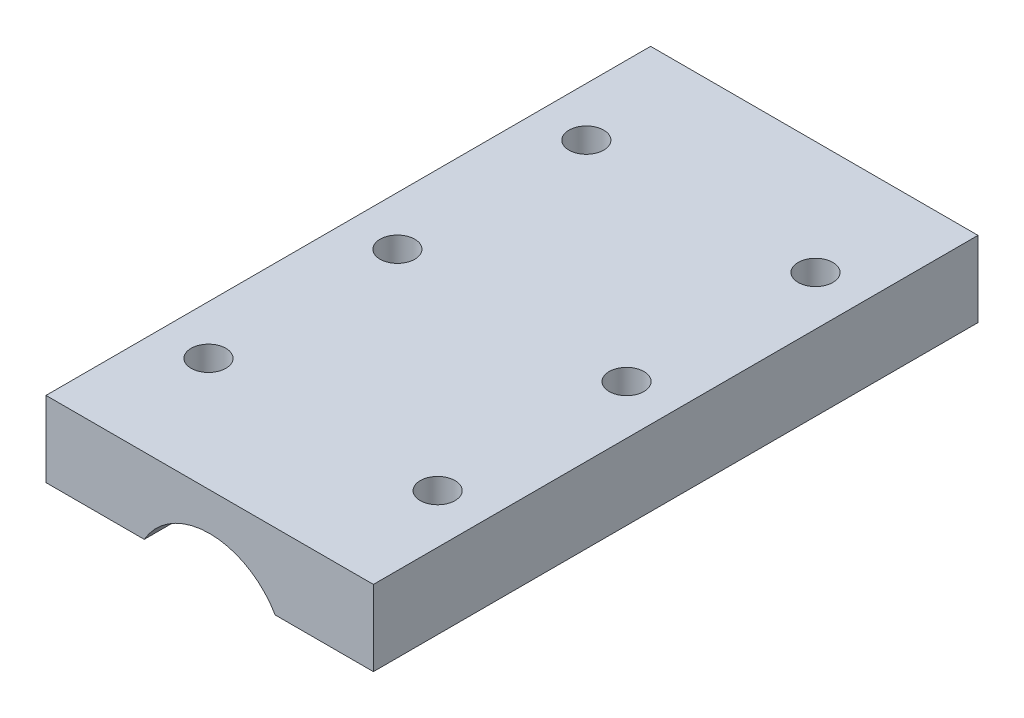
ISO-10303-21;
HEADER;
FILE_DESCRIPTION(('STEP AP214'),'2;1');
FILE_NAME('part.step','',(''),(''),'','','');
FILE_SCHEMA(('AUTOMOTIVE_DESIGN { 1 0 10303 214 1 1 1 1 }'));
ENDSEC;
DATA;
#1=APPLICATION_CONTEXT('core data for automotive mechanical design processes');
#2=APPLICATION_PROTOCOL_DEFINITION('international standard','automotive_design',2000,#1);
#3=PRODUCT_CONTEXT('',#1,'mechanical');
#4=PRODUCT('Part','Part','',(#3));
#5=PRODUCT_RELATED_PRODUCT_CATEGORY('part','',(#4));
#6=PRODUCT_DEFINITION_FORMATION('','',#4);
#7=PRODUCT_DEFINITION_CONTEXT('part definition',#1,'design');
#8=PRODUCT_DEFINITION('design','',#6,#7);
#9=PRODUCT_DEFINITION_SHAPE('','',#8);
#10=(LENGTH_UNIT() NAMED_UNIT(*) SI_UNIT(.MILLI.,.METRE.));
#11=(NAMED_UNIT(*) PLANE_ANGLE_UNIT() SI_UNIT($,.RADIAN.));
#12=(NAMED_UNIT(*) SI_UNIT($,.STERADIAN.) SOLID_ANGLE_UNIT());
#13=UNCERTAINTY_MEASURE_WITH_UNIT(LENGTH_MEASURE(1.E-05),#10,'distance_accuracy_value','');
#14=(GEOMETRIC_REPRESENTATION_CONTEXT(3) GLOBAL_UNCERTAINTY_ASSIGNED_CONTEXT((#13)) GLOBAL_UNIT_ASSIGNED_CONTEXT((#10,
#11,#12)) REPRESENTATION_CONTEXT('',''));
#15=CARTESIAN_POINT('',(0.,0.,0.));
#16=DIRECTION('',(0.,0.,1.));
#17=DIRECTION('',(1.,0.,0.));
#18=AXIS2_PLACEMENT_3D('',#15,#16,#17);
#19=CARTESIAN_POINT('',(0.,0.,0.));
#20=DIRECTION('',(0.,-1.,0.));
#21=DIRECTION('',(0.,0.,-1.));
#22=AXIS2_PLACEMENT_3D('',#19,#20,#21);
#23=PLANE('',#22);
#24=CARTESIAN_POINT('',(7.58012701999999,0.,0.));
#25=DIRECTION('',(0.,-1.,0.));
#26=DIRECTION('',(0.,0.,-1.));
#27=AXIS2_PLACEMENT_3D('',#24,#25,#26);
#28=CIRCLE('',#27,1.15);
#29=CARTESIAN_POINT('',(7.58012701999999,0.,-1.15));
#30=VERTEX_POINT('',#29);
#31=EDGE_CURVE('E160',#30,#30,#28,.T.);
#32=ORIENTED_EDGE('',*,*,#31,.F.);
#33=EDGE_LOOP('',(#32));
#34=FACE_BOUND('',#33,.T.);
#35=CARTESIAN_POINT('',(7.58012701999999,0.,-12.5));
#36=DIRECTION('',(0.,-1.,0.));
#37=DIRECTION('',(0.,0.,1.));
#38=AXIS2_PLACEMENT_3D('',#35,#36,#37);
#39=CIRCLE('',#38,1.15);
#40=CARTESIAN_POINT('',(7.58012701999999,0.,-11.35));
#41=VERTEX_POINT('',#40);
#42=EDGE_CURVE('E166',#41,#41,#39,.T.);
#43=ORIENTED_EDGE('',*,*,#42,.F.);
#44=EDGE_LOOP('',(#43));
#45=FACE_BOUND('',#44,.T.);
#46=CARTESIAN_POINT('',(7.58012701999999,0.,12.5));
#47=DIRECTION('',(0.,-1.,0.));
#48=DIRECTION('',(0.,0.,-1.));
#49=AXIS2_PLACEMENT_3D('',#46,#47,#48);
#50=CIRCLE('',#49,1.15);
#51=CARTESIAN_POINT('',(7.58012701999999,0.,11.35));
#52=VERTEX_POINT('',#51);
#53=EDGE_CURVE('E140',#52,#52,#50,.T.);
#54=ORIENTED_EDGE('',*,*,#53,.F.);
#55=EDGE_LOOP('',(#54));
#56=FACE_BOUND('',#55,.T.);
#57=DIRECTION('',(0.,0.,1.));
#58=VECTOR('',#57,1.);
#59=CARTESIAN_POINT('',(4.33012702,0.,-29.0138781912488));
#60=LINE('',#59,#58);
#61=CARTESIAN_POINT('',(4.33012702,0.,-20.));
#62=VERTEX_POINT('',#61);
#63=CARTESIAN_POINT('',(4.33012702,0.,20.));
#64=VERTEX_POINT('',#63);
#65=EDGE_CURVE('E95',#62,#64,#60,.T.);
#66=ORIENTED_EDGE('',*,*,#65,.F.);
#67=DIRECTION('',(-1.,0.,0.));
#68=VECTOR('',#67,1.);
#69=CARTESIAN_POINT('',(10.83012702,0.,-20.));
#70=LINE('',#69,#68);
#71=CARTESIAN_POINT('',(10.83012702,0.,-20.));
#72=VERTEX_POINT('',#71);
#73=EDGE_CURVE('E120',#72,#62,#70,.T.);
#74=ORIENTED_EDGE('',*,*,#73,.F.);
#75=DIRECTION('',(0.,0.,-1.));
#76=VECTOR('',#75,1.);
#77=CARTESIAN_POINT('',(10.83012702,0.,-20.));
#78=LINE('',#77,#76);
#79=CARTESIAN_POINT('',(10.83012702,0.,20.));
#80=VERTEX_POINT('',#79);
#81=EDGE_CURVE('E112',#80,#72,#78,.T.);
#82=ORIENTED_EDGE('',*,*,#81,.F.);
#83=DIRECTION('',(1.,0.,0.));
#84=VECTOR('',#83,1.);
#85=CARTESIAN_POINT('',(10.83012702,0.,20.));
#86=LINE('',#85,#84);
#87=EDGE_CURVE('E106',#64,#80,#86,.T.);
#88=ORIENTED_EDGE('',*,*,#87,.F.);
#89=EDGE_LOOP('',(#66,#74,#82,#88));
#90=FACE_BOUND('',#89,.T.);
#91=ADVANCED_FACE('F35',(#34,#45,#56,#90),#23,.T.);
#92=CARTESIAN_POINT('',(-10.83012702,5.,-20.));
#93=DIRECTION('',(1.,0.,0.));
#94=DIRECTION('',(0.,0.,-1.));
#95=AXIS2_PLACEMENT_3D('',#92,#93,#94);
#96=PLANE('',#95);
#97=DIRECTION('',(0.,0.,1.));
#98=VECTOR('',#97,1.);
#99=CARTESIAN_POINT('',(-10.83012702,0.,-20.));
#100=LINE('',#99,#98);
#101=CARTESIAN_POINT('',(-10.83012702,0.,-20.));
#102=VERTEX_POINT('',#101);
#103=CARTESIAN_POINT('',(-10.83012702,0.,20.));
#104=VERTEX_POINT('',#103);
#105=EDGE_CURVE('E113',#102,#104,#100,.T.);
#106=ORIENTED_EDGE('',*,*,#105,.T.);
#107=DIRECTION('',(0.,-1.,0.));
#108=VECTOR('',#107,1.);
#109=CARTESIAN_POINT('',(-10.83012702,5.,20.));
#110=LINE('',#109,#108);
#111=CARTESIAN_POINT('',(-10.83012702,5.,20.));
#112=VERTEX_POINT('',#111);
#113=EDGE_CURVE('E11',#112,#104,#110,.T.);
#114=ORIENTED_EDGE('',*,*,#113,.F.);
#115=DIRECTION('',(0.,0.,1.));
#116=VECTOR('',#115,1.);
#117=CARTESIAN_POINT('',(-10.83012702,5.,-20.));
#118=LINE('',#117,#116);
#119=CARTESIAN_POINT('',(-10.83012702,5.,-20.));
#120=VERTEX_POINT('',#119);
#121=EDGE_CURVE('E122',#120,#112,#118,.T.);
#122=ORIENTED_EDGE('',*,*,#121,.F.);
#123=DIRECTION('',(0.,-1.,0.));
#124=VECTOR('',#123,1.);
#125=CARTESIAN_POINT('',(-10.83012702,5.,-20.));
#126=LINE('',#125,#124);
#127=EDGE_CURVE('E123',#120,#102,#126,.T.);
#128=ORIENTED_EDGE('',*,*,#127,.T.);
#129=EDGE_LOOP('',(#106,#114,#122,#128));
#130=FACE_BOUND('',#129,.T.);
#131=ADVANCED_FACE('F37',(#130),#96,.F.);
#132=CARTESIAN_POINT('',(10.83012702,5.,20.));
#133=DIRECTION('',(0.,0.,-1.));
#134=DIRECTION('',(-1.,0.,0.));
#135=AXIS2_PLACEMENT_3D('',#132,#133,#134);
#136=PLANE('',#135);
#137=CARTESIAN_POINT('',(-4.33012702,0.,20.));
#138=VERTEX_POINT('',#137);
#139=EDGE_CURVE('E108',#104,#138,#86,.T.);
#140=ORIENTED_EDGE('',*,*,#139,.T.);
#141=CARTESIAN_POINT('',(0.,-2.49999999813319,20.));
#142=DIRECTION('',(0.,0.,1.));
#143=DIRECTION('',(-1.,0.,0.));
#144=AXIS2_PLACEMENT_3D('',#141,#142,#143);
#145=CIRCLE('',#144,5.);
#146=EDGE_CURVE('E50',#64,#138,#145,.T.);
#147=ORIENTED_EDGE('',*,*,#146,.F.);
#148=ORIENTED_EDGE('',*,*,#87,.T.);
#149=DIRECTION('',(0.,-1.,0.));
#150=VECTOR('',#149,1.);
#151=CARTESIAN_POINT('',(10.83012702,5.,20.));
#152=LINE('',#151,#150);
#153=CARTESIAN_POINT('',(10.83012702,5.,20.));
#154=VERTEX_POINT('',#153);
#155=EDGE_CURVE('E43',#154,#80,#152,.T.);
#156=ORIENTED_EDGE('',*,*,#155,.F.);
#157=DIRECTION('',(1.,0.,0.));
#158=VECTOR('',#157,1.);
#159=CARTESIAN_POINT('',(10.83012702,5.,20.));
#160=LINE('',#159,#158);
#161=EDGE_CURVE('E87',#112,#154,#160,.T.);
#162=ORIENTED_EDGE('',*,*,#161,.F.);
#163=ORIENTED_EDGE('',*,*,#113,.T.);
#164=EDGE_LOOP('',(#140,#147,#148,#156,#162,#163));
#165=FACE_BOUND('',#164,.T.);
#166=ADVANCED_FACE('F105',(#165),#136,.F.);
#167=CARTESIAN_POINT('',(10.83012702,5.,-20.));
#168=DIRECTION('',(-1.,0.,0.));
#169=DIRECTION('',(0.,0.,1.));
#170=AXIS2_PLACEMENT_3D('',#167,#168,#169);
#171=PLANE('',#170);
#172=ORIENTED_EDGE('',*,*,#81,.T.);
#173=DIRECTION('',(0.,-1.,0.));
#174=VECTOR('',#173,1.);
#175=CARTESIAN_POINT('',(10.83012702,5.,-20.));
#176=LINE('',#175,#174);
#177=CARTESIAN_POINT('',(10.83012702,5.,-20.));
#178=VERTEX_POINT('',#177);
#179=EDGE_CURVE('E125',#178,#72,#176,.T.);
#180=ORIENTED_EDGE('',*,*,#179,.F.);
#181=DIRECTION('',(0.,0.,-1.));
#182=VECTOR('',#181,1.);
#183=CARTESIAN_POINT('',(10.83012702,5.,-20.));
#184=LINE('',#183,#182);
#185=EDGE_CURVE('E131',#154,#178,#184,.T.);
#186=ORIENTED_EDGE('',*,*,#185,.F.);
#187=ORIENTED_EDGE('',*,*,#155,.T.);
#188=EDGE_LOOP('',(#172,#180,#186,#187));
#189=FACE_BOUND('',#188,.T.);
#190=ADVANCED_FACE('F129',(#189),#171,.F.);
#191=CARTESIAN_POINT('',(10.83012702,5.,-20.));
#192=DIRECTION('',(0.,0.,1.));
#193=DIRECTION('',(1.,0.,0.));
#194=AXIS2_PLACEMENT_3D('',#191,#192,#193);
#195=PLANE('',#194);
#196=ORIENTED_EDGE('',*,*,#73,.T.);
#197=CARTESIAN_POINT('',(0.,-2.49999999813319,-20.));
#198=DIRECTION('',(0.,0.,1.));
#199=DIRECTION('',(1.,0.,0.));
#200=AXIS2_PLACEMENT_3D('',#197,#198,#199);
#201=CIRCLE('',#200,5.);
#202=CARTESIAN_POINT('',(-4.33012702,0.,-20.));
#203=VERTEX_POINT('',#202);
#204=EDGE_CURVE('E97',#203,#62,#201,.F.);
#205=ORIENTED_EDGE('',*,*,#204,.F.);
#206=EDGE_CURVE('E80',#203,#102,#70,.T.);
#207=ORIENTED_EDGE('',*,*,#206,.T.);
#208=ORIENTED_EDGE('',*,*,#127,.F.);
#209=DIRECTION('',(-1.,0.,0.));
#210=VECTOR('',#209,1.);
#211=CARTESIAN_POINT('',(10.83012702,5.,-20.));
#212=LINE('',#211,#210);
#213=EDGE_CURVE('E59',#178,#120,#212,.T.);
#214=ORIENTED_EDGE('',*,*,#213,.F.);
#215=ORIENTED_EDGE('',*,*,#179,.T.);
#216=EDGE_LOOP('',(#196,#205,#207,#208,#214,#215));
#217=FACE_BOUND('',#216,.T.);
#218=ADVANCED_FACE('F205',(#217),#195,.F.);
#219=CARTESIAN_POINT('',(0.,5.,0.));
#220=DIRECTION('',(0.,-1.,0.));
#221=DIRECTION('',(0.,0.,-1.));
#222=AXIS2_PLACEMENT_3D('',#219,#220,#221);
#223=PLANE('',#222);
#224=CARTESIAN_POINT('',(-7.58012701999999,5.,12.5));
#225=DIRECTION('',(0.,-1.,0.));
#226=DIRECTION('',(0.,0.,-1.));
#227=AXIS2_PLACEMENT_3D('',#224,#225,#226);
#228=CIRCLE('',#227,1.15);
#229=CARTESIAN_POINT('',(-7.58012701999999,5.,11.35));
#230=VERTEX_POINT('',#229);
#231=EDGE_CURVE('E144',#230,#230,#228,.F.);
#232=ORIENTED_EDGE('',*,*,#231,.F.);
#233=EDGE_LOOP('',(#232));
#234=FACE_BOUND('',#233,.T.);
#235=CARTESIAN_POINT('',(-7.58012701999999,5.,0.));
#236=DIRECTION('',(0.,-1.,0.));
#237=DIRECTION('',(0.,0.,-1.));
#238=AXIS2_PLACEMENT_3D('',#235,#236,#237);
#239=CIRCLE('',#238,1.15);
#240=CARTESIAN_POINT('',(-7.58012701999999,5.,-1.15));
#241=VERTEX_POINT('',#240);
#242=EDGE_CURVE('E151',#241,#241,#239,.F.);
#243=ORIENTED_EDGE('',*,*,#242,.F.);
#244=EDGE_LOOP('',(#243));
#245=FACE_BOUND('',#244,.T.);
#246=CARTESIAN_POINT('',(-7.58012701999999,5.,-12.5));
#247=DIRECTION('',(0.,-1.,0.));
#248=DIRECTION('',(0.,0.,-1.));
#249=AXIS2_PLACEMENT_3D('',#246,#247,#248);
#250=CIRCLE('',#249,1.15);
#251=CARTESIAN_POINT('',(-7.58012701999999,5.,-13.65));
#252=VERTEX_POINT('',#251);
#253=EDGE_CURVE('E157',#252,#252,#250,.F.);
#254=ORIENTED_EDGE('',*,*,#253,.F.);
#255=EDGE_LOOP('',(#254));
#256=FACE_BOUND('',#255,.T.);
#257=CARTESIAN_POINT('',(7.58012701999999,5.,0.));
#258=DIRECTION('',(0.,-1.,0.));
#259=DIRECTION('',(0.,0.,-1.));
#260=AXIS2_PLACEMENT_3D('',#257,#258,#259);
#261=CIRCLE('',#260,1.15);
#262=CARTESIAN_POINT('',(7.58012701999999,5.,-1.15));
#263=VERTEX_POINT('',#262);
#264=EDGE_CURVE('E163',#263,#263,#261,.F.);
#265=ORIENTED_EDGE('',*,*,#264,.F.);
#266=EDGE_LOOP('',(#265));
#267=FACE_BOUND('',#266,.T.);
#268=CARTESIAN_POINT('',(7.58012701999999,5.,-12.5));
#269=DIRECTION('',(0.,-1.,0.));
#270=DIRECTION('',(0.,0.,-1.));
#271=AXIS2_PLACEMENT_3D('',#268,#269,#270);
#272=CIRCLE('',#271,1.15);
#273=CARTESIAN_POINT('',(7.58012701999999,5.,-13.65));
#274=VERTEX_POINT('',#273);
#275=EDGE_CURVE('E143',#274,#274,#272,.F.);
#276=ORIENTED_EDGE('',*,*,#275,.F.);
#277=EDGE_LOOP('',(#276));
#278=FACE_BOUND('',#277,.T.);
#279=CARTESIAN_POINT('',(7.58012701999999,5.,12.5));
#280=DIRECTION('',(0.,-1.,0.));
#281=DIRECTION('',(0.,0.,-1.));
#282=AXIS2_PLACEMENT_3D('',#279,#280,#281);
#283=CIRCLE('',#282,1.15);
#284=CARTESIAN_POINT('',(7.58012701999999,5.,11.35));
#285=VERTEX_POINT('',#284);
#286=EDGE_CURVE('E109',#285,#285,#283,.F.);
#287=ORIENTED_EDGE('',*,*,#286,.F.);
#288=EDGE_LOOP('',(#287));
#289=FACE_BOUND('',#288,.T.);
#290=ORIENTED_EDGE('',*,*,#121,.T.);
#291=ORIENTED_EDGE('',*,*,#161,.T.);
#292=ORIENTED_EDGE('',*,*,#185,.T.);
#293=ORIENTED_EDGE('',*,*,#213,.T.);
#294=EDGE_LOOP('',(#290,#291,#292,#293));
#295=FACE_BOUND('',#294,.T.);
#296=ADVANCED_FACE('F203',(#234,#245,#256,#267,#278,#289,#295),#223,.F.);
#297=CARTESIAN_POINT('',(-7.58012701999999,0.,12.5));
#298=DIRECTION('',(0.,-1.,0.));
#299=DIRECTION('',(0.,0.,1.));
#300=AXIS2_PLACEMENT_3D('',#297,#298,#299);
#301=CIRCLE('',#300,1.15);
#302=CARTESIAN_POINT('',(-7.58012701999999,0.,13.65));
#303=VERTEX_POINT('',#302);
#304=EDGE_CURVE('E148',#303,#303,#301,.T.);
#305=ORIENTED_EDGE('',*,*,#304,.F.);
#306=EDGE_LOOP('',(#305));
#307=FACE_BOUND('',#306,.T.);
#308=CARTESIAN_POINT('',(-7.58012701999999,0.,0.));
#309=DIRECTION('',(0.,-1.,0.));
#310=DIRECTION('',(0.,0.,1.));
#311=AXIS2_PLACEMENT_3D('',#308,#309,#310);
#312=CIRCLE('',#311,1.15);
#313=CARTESIAN_POINT('',(-7.58012701999999,0.,1.15));
#314=VERTEX_POINT('',#313);
#315=EDGE_CURVE('E147',#314,#314,#312,.T.);
#316=ORIENTED_EDGE('',*,*,#315,.F.);
#317=EDGE_LOOP('',(#316));
#318=FACE_BOUND('',#317,.T.);
#319=CARTESIAN_POINT('',(-7.58012701999999,0.,-12.5));
#320=DIRECTION('',(0.,-1.,0.));
#321=DIRECTION('',(0.,0.,-1.));
#322=AXIS2_PLACEMENT_3D('',#319,#320,#321);
#323=CIRCLE('',#322,1.15);
#324=CARTESIAN_POINT('',(-7.58012701999999,0.,-13.65));
#325=VERTEX_POINT('',#324);
#326=EDGE_CURVE('E154',#325,#325,#323,.T.);
#327=ORIENTED_EDGE('',*,*,#326,.F.);
#328=EDGE_LOOP('',(#327));
#329=FACE_BOUND('',#328,.T.);
#330=DIRECTION('',(0.,0.,1.));
#331=VECTOR('',#330,1.);
#332=CARTESIAN_POINT('',(-4.33012702,0.,-29.0138781912488));
#333=LINE('',#332,#331);
#334=EDGE_CURVE('E102',#203,#138,#333,.T.);
#335=ORIENTED_EDGE('',*,*,#334,.T.);
#336=ORIENTED_EDGE('',*,*,#139,.F.);
#337=ORIENTED_EDGE('',*,*,#105,.F.);
#338=ORIENTED_EDGE('',*,*,#206,.F.);
#339=EDGE_LOOP('',(#335,#336,#337,#338));
#340=FACE_BOUND('',#339,.T.);
#341=ADVANCED_FACE('F180',(#307,#318,#329,#340),#23,.T.);
#342=CARTESIAN_POINT('',(0.,-2.49999999813319,-29.0138781912488));
#343=DIRECTION('',(0.,0.,1.));
#344=DIRECTION('',(1.,0.,0.));
#345=AXIS2_PLACEMENT_3D('',#342,#343,#344);
#346=CYLINDRICAL_SURFACE('',#345,5.);
#347=ORIENTED_EDGE('',*,*,#204,.T.);
#348=ORIENTED_EDGE('',*,*,#65,.T.);
#349=ORIENTED_EDGE('',*,*,#146,.T.);
#350=ORIENTED_EDGE('',*,*,#334,.F.);
#351=EDGE_LOOP('',(#347,#348,#349,#350));
#352=FACE_BOUND('',#351,.T.);
#353=ADVANCED_FACE('F96',(#352),#346,.F.);
#354=CARTESIAN_POINT('',(-7.58012701999999,8.25269119345812,-12.5));
#355=DIRECTION('',(0.,-1.,0.));
#356=DIRECTION('',(0.,0.,-1.));
#357=AXIS2_PLACEMENT_3D('',#354,#355,#356);
#358=CYLINDRICAL_SURFACE('',#357,1.15);
#359=ORIENTED_EDGE('',*,*,#253,.T.);
#360=EDGE_LOOP('',(#359));
#361=FACE_BOUND('',#360,.T.);
#362=ORIENTED_EDGE('',*,*,#326,.T.);
#363=EDGE_LOOP('',(#362));
#364=FACE_BOUND('',#363,.T.);
#365=ADVANCED_FACE('F202',(#361,#364),#358,.F.);
#366=CARTESIAN_POINT('',(-7.58012701999999,8.25269119345812,0.));
#367=DIRECTION('',(0.,-1.,0.));
#368=DIRECTION('',(0.,0.,-1.));
#369=AXIS2_PLACEMENT_3D('',#366,#367,#368);
#370=CYLINDRICAL_SURFACE('',#369,1.15);
#371=ORIENTED_EDGE('',*,*,#242,.T.);
#372=EDGE_LOOP('',(#371));
#373=FACE_BOUND('',#372,.T.);
#374=ORIENTED_EDGE('',*,*,#315,.T.);
#375=EDGE_LOOP('',(#374));
#376=FACE_BOUND('',#375,.T.);
#377=ADVANCED_FACE('F195',(#373,#376),#370,.F.);
#378=CARTESIAN_POINT('',(-7.58012701999999,8.25269119345812,12.5));
#379=DIRECTION('',(0.,-1.,0.));
#380=DIRECTION('',(0.,0.,-1.));
#381=AXIS2_PLACEMENT_3D('',#378,#379,#380);
#382=CYLINDRICAL_SURFACE('',#381,1.15);
#383=ORIENTED_EDGE('',*,*,#231,.T.);
#384=EDGE_LOOP('',(#383));
#385=FACE_BOUND('',#384,.T.);
#386=ORIENTED_EDGE('',*,*,#304,.T.);
#387=EDGE_LOOP('',(#386));
#388=FACE_BOUND('',#387,.T.);
#389=ADVANCED_FACE('F185',(#385,#388),#382,.F.);
#390=CARTESIAN_POINT('',(7.58012701999999,8.25269119345812,12.5));
#391=DIRECTION('',(0.,-1.,0.));
#392=DIRECTION('',(0.,0.,-1.));
#393=AXIS2_PLACEMENT_3D('',#390,#391,#392);
#394=CYLINDRICAL_SURFACE('',#393,1.15);
#395=ORIENTED_EDGE('',*,*,#286,.T.);
#396=EDGE_LOOP('',(#395));
#397=FACE_BOUND('',#396,.T.);
#398=ORIENTED_EDGE('',*,*,#53,.T.);
#399=EDGE_LOOP('',(#398));
#400=FACE_BOUND('',#399,.T.);
#401=ADVANCED_FACE('F183',(#397,#400),#394,.F.);
#402=CARTESIAN_POINT('',(7.58012701999999,8.25269119345812,-12.5));
#403=DIRECTION('',(0.,-1.,0.));
#404=DIRECTION('',(0.,0.,-1.));
#405=AXIS2_PLACEMENT_3D('',#402,#403,#404);
#406=CYLINDRICAL_SURFACE('',#405,1.15);
#407=ORIENTED_EDGE('',*,*,#275,.T.);
#408=EDGE_LOOP('',(#407));
#409=FACE_BOUND('',#408,.T.);
#410=ORIENTED_EDGE('',*,*,#42,.T.);
#411=EDGE_LOOP('',(#410));
#412=FACE_BOUND('',#411,.T.);
#413=ADVANCED_FACE('F174',(#409,#412),#406,.F.);
#414=CARTESIAN_POINT('',(7.58012701999999,8.25269119345812,0.));
#415=DIRECTION('',(0.,-1.,0.));
#416=DIRECTION('',(0.,0.,-1.));
#417=AXIS2_PLACEMENT_3D('',#414,#415,#416);
#418=CYLINDRICAL_SURFACE('',#417,1.15);
#419=ORIENTED_EDGE('',*,*,#264,.T.);
#420=EDGE_LOOP('',(#419));
#421=FACE_BOUND('',#420,.T.);
#422=ORIENTED_EDGE('',*,*,#31,.T.);
#423=EDGE_LOOP('',(#422));
#424=FACE_BOUND('',#423,.T.);
#425=ADVANCED_FACE('F192',(#421,#424),#418,.F.);
#426=CLOSED_SHELL('',(#91,#131,#166,#190,#218,#296,#341,#353,#365,#377,#389,#401,#413,#425));
#427=MANIFOLD_SOLID_BREP('B2',#426);
#428=ADVANCED_BREP_SHAPE_REPRESENTATION('',(#18,#427),#14);
#429=SHAPE_DEFINITION_REPRESENTATION(#9,#428);
ENDSEC;
END-ISO-10303-21;
